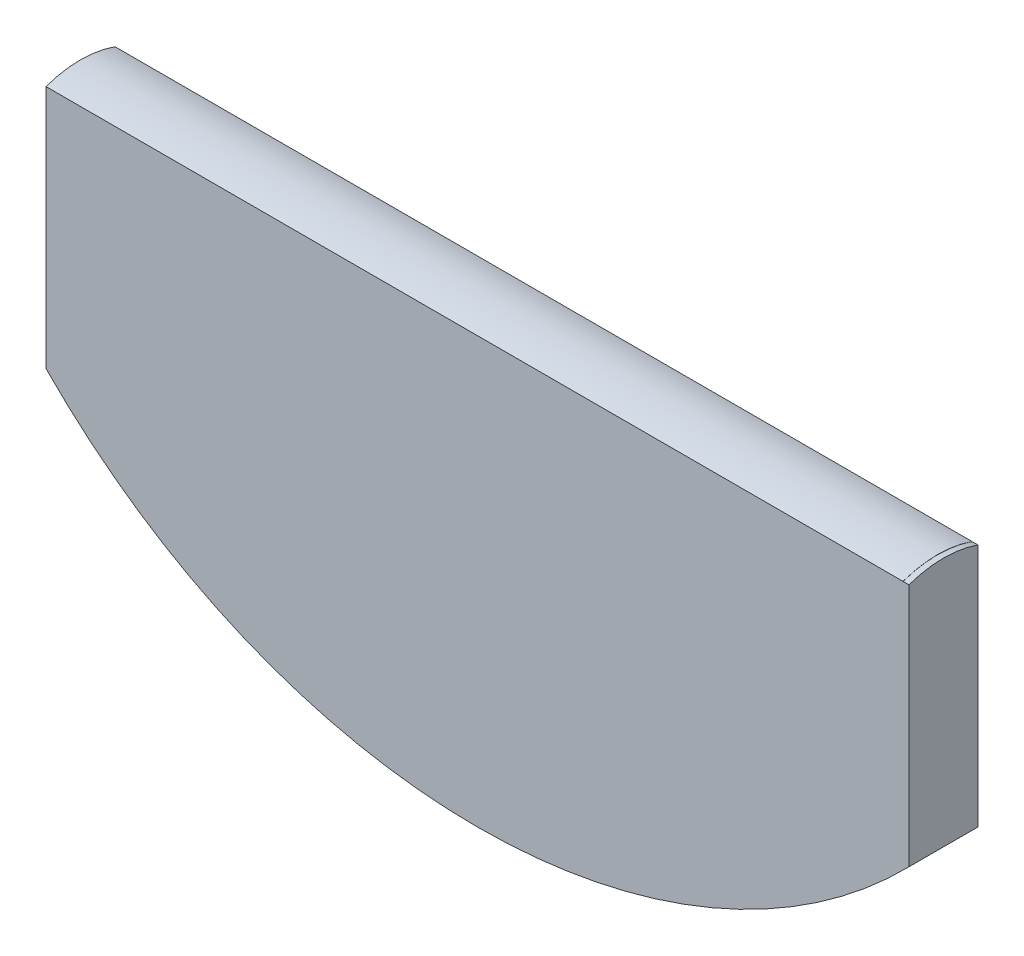
ISO-10303-21;
HEADER;
FILE_DESCRIPTION(('STEP AP214'),'2;1');
FILE_NAME('part.step','',(''),(''),'','','');
FILE_SCHEMA(('AUTOMOTIVE_DESIGN { 1 0 10303 214 1 1 1 1 }'));
ENDSEC;
DATA;
#1=APPLICATION_CONTEXT('core data for automotive mechanical design processes');
#2=APPLICATION_PROTOCOL_DEFINITION('international standard','automotive_design',2000,#1);
#3=PRODUCT_CONTEXT('',#1,'mechanical');
#4=PRODUCT('Part','Part','',(#3));
#5=PRODUCT_RELATED_PRODUCT_CATEGORY('part','',(#4));
#6=PRODUCT_DEFINITION_FORMATION('','',#4);
#7=PRODUCT_DEFINITION_CONTEXT('part definition',#1,'design');
#8=PRODUCT_DEFINITION('design','',#6,#7);
#9=PRODUCT_DEFINITION_SHAPE('','',#8);
#10=(LENGTH_UNIT() NAMED_UNIT(*) SI_UNIT(.MILLI.,.METRE.));
#11=(NAMED_UNIT(*) PLANE_ANGLE_UNIT() SI_UNIT($,.RADIAN.));
#12=(NAMED_UNIT(*) SI_UNIT($,.STERADIAN.) SOLID_ANGLE_UNIT());
#13=UNCERTAINTY_MEASURE_WITH_UNIT(LENGTH_MEASURE(1.E-05),#10,'distance_accuracy_value','');
#14=(GEOMETRIC_REPRESENTATION_CONTEXT(3) GLOBAL_UNCERTAINTY_ASSIGNED_CONTEXT((#13)) GLOBAL_UNIT_ASSIGNED_CONTEXT((#10,
#11,#12)) REPRESENTATION_CONTEXT('',''));
#15=CARTESIAN_POINT('',(0.,0.,0.));
#16=DIRECTION('',(0.,0.,1.));
#17=DIRECTION('',(1.,0.,0.));
#18=AXIS2_PLACEMENT_3D('',#15,#16,#17);
#19=CARTESIAN_POINT('',(0.,0.,2.));
#20=DIRECTION('',(0.,0.,-1.));
#21=DIRECTION('',(-1.,0.,0.));
#22=AXIS2_PLACEMENT_3D('',#19,#20,#21);
#23=CYLINDRICAL_SURFACE('',#22,35.);
#24=CARTESIAN_POINT('',(0.,0.,-2.));
#25=DIRECTION('',(0.,0.,1.));
#26=DIRECTION('',(1.,0.,0.));
#27=AXIS2_PLACEMENT_3D('',#24,#25,#26);
#28=CIRCLE('',#27,35.);
#29=CARTESIAN_POINT('',(-25.,-24.4948974278318,-2.));
#30=VERTEX_POINT('',#29);
#31=CARTESIAN_POINT('',(25.,-24.4948974278318,-2.));
#32=VERTEX_POINT('',#31);
#33=EDGE_CURVE('E420',#30,#32,#28,.T.);
#34=ORIENTED_EDGE('',*,*,#33,.T.);
#35=DIRECTION('',(0.,0.,-1.));
#36=VECTOR('',#35,1.);
#37=CARTESIAN_POINT('',(25.,-24.4948974278318,2.));
#38=LINE('',#37,#36);
#39=CARTESIAN_POINT('',(25.,-24.4948974278318,2.));
#40=VERTEX_POINT('',#39);
#41=EDGE_CURVE('E441',#40,#32,#38,.T.);
#42=ORIENTED_EDGE('',*,*,#41,.F.);
#43=CARTESIAN_POINT('',(0.,0.,2.));
#44=DIRECTION('',(0.,0.,1.));
#45=DIRECTION('',(1.,0.,0.));
#46=AXIS2_PLACEMENT_3D('',#43,#44,#45);
#47=CIRCLE('',#46,35.);
#48=CARTESIAN_POINT('',(-25.,-24.4948974278318,2.));
#49=VERTEX_POINT('',#48);
#50=EDGE_CURVE('E433',#49,#40,#47,.T.);
#51=ORIENTED_EDGE('',*,*,#50,.F.);
#52=DIRECTION('',(0.,0.,-1.));
#53=VECTOR('',#52,1.);
#54=CARTESIAN_POINT('',(-25.,-24.4948974278318,2.));
#55=LINE('',#54,#53);
#56=EDGE_CURVE('E438',#49,#30,#55,.T.);
#57=ORIENTED_EDGE('',*,*,#56,.T.);
#58=EDGE_LOOP('',(#34,#42,#51,#57));
#59=FACE_BOUND('',#58,.T.);
#60=ADVANCED_FACE('F349',(#59),#23,.T.);
#61=CARTESIAN_POINT('',(25.,-10.,2.));
#62=DIRECTION('',(-1.,0.,0.));
#63=DIRECTION('',(0.,-1.,0.));
#64=AXIS2_PLACEMENT_3D('',#61,#62,#63);
#65=PLANE('',#64);
#66=DIRECTION('',(0.,1.,0.));
#67=VECTOR('',#66,1.);
#68=CARTESIAN_POINT('',(25.,-10.,-2.));
#69=LINE('',#68,#67);
#70=CARTESIAN_POINT('',(25.,-10.3431457505076,-2.));
#71=VERTEX_POINT('',#70);
#72=EDGE_CURVE('E423',#32,#71,#69,.T.);
#73=ORIENTED_EDGE('',*,*,#72,.T.);
#74=CARTESIAN_POINT('',(25.,-16.,0.));
#75=DIRECTION('',(-1.,0.,0.));
#76=DIRECTION('',(0.,-1.,0.));
#77=AXIS2_PLACEMENT_3D('',#74,#75,#76);
#78=CIRCLE('',#77,6.);
#79=CARTESIAN_POINT('',(25.,-10.3431457505076,2.));
#80=VERTEX_POINT('',#79);
#81=EDGE_CURVE('E425',#71,#80,#78,.F.);
#82=ORIENTED_EDGE('',*,*,#81,.T.);
#83=DIRECTION('',(0.,1.,0.));
#84=VECTOR('',#83,1.);
#85=CARTESIAN_POINT('',(25.,-10.,2.));
#86=LINE('',#85,#84);
#87=EDGE_CURVE('E435',#40,#80,#86,.T.);
#88=ORIENTED_EDGE('',*,*,#87,.F.);
#89=ORIENTED_EDGE('',*,*,#41,.T.);
#90=EDGE_LOOP('',(#73,#82,#88,#89));
#91=FACE_BOUND('',#90,.T.);
#92=ADVANCED_FACE('F455',(#91),#65,.F.);
#93=CARTESIAN_POINT('',(-25.,-10.,2.));
#94=DIRECTION('',(1.,0.,0.));
#95=DIRECTION('',(0.,1.,0.));
#96=AXIS2_PLACEMENT_3D('',#93,#94,#95);
#97=PLANE('',#96);
#98=CARTESIAN_POINT('',(-25.,-16.,0.));
#99=DIRECTION('',(1.,0.,0.));
#100=DIRECTION('',(0.,1.,0.));
#101=AXIS2_PLACEMENT_3D('',#98,#99,#100);
#102=CIRCLE('',#101,6.);
#103=CARTESIAN_POINT('',(-25.,-10.3431457505076,2.));
#104=VERTEX_POINT('',#103);
#105=CARTESIAN_POINT('',(-25.,-10.3431457505076,-2.));
#106=VERTEX_POINT('',#105);
#107=EDGE_CURVE('E403',#104,#106,#102,.F.);
#108=ORIENTED_EDGE('',*,*,#107,.T.);
#109=DIRECTION('',(0.,-1.,0.));
#110=VECTOR('',#109,1.);
#111=CARTESIAN_POINT('',(-25.,-10.,-2.));
#112=LINE('',#111,#110);
#113=EDGE_CURVE('E431',#106,#30,#112,.T.);
#114=ORIENTED_EDGE('',*,*,#113,.T.);
#115=ORIENTED_EDGE('',*,*,#56,.F.);
#116=DIRECTION('',(0.,-1.,0.));
#117=VECTOR('',#116,1.);
#118=CARTESIAN_POINT('',(-25.,-10.,2.));
#119=LINE('',#118,#117);
#120=EDGE_CURVE('E371',#104,#49,#119,.T.);
#121=ORIENTED_EDGE('',*,*,#120,.F.);
#122=EDGE_LOOP('',(#108,#114,#115,#121));
#123=FACE_BOUND('',#122,.T.);
#124=ADVANCED_FACE('F450',(#123),#97,.F.);
#125=CARTESIAN_POINT('',(0.,0.,2.));
#126=DIRECTION('',(0.,0.,1.));
#127=DIRECTION('',(1.,0.,0.));
#128=AXIS2_PLACEMENT_3D('',#125,#126,#127);
#129=PLANE('',#128);
#130=CARTESIAN_POINT('',(25.,-16.,2.));
#131=DIRECTION('',(0.,0.,1.));
#132=DIRECTION('',(1.,0.,0.));
#133=AXIS2_PLACEMENT_3D('',#130,#131,#132);
#134=CIRCLE('',#133,5.65685424949238);
#135=CARTESIAN_POINT('',(24.6537342061364,-10.3537534591554,2.));
#136=VERTEX_POINT('',#135);
#137=EDGE_CURVE('E419',#136,#80,#134,.F.);
#138=ORIENTED_EDGE('',*,*,#137,.F.);
#139=DIRECTION('',(0.,-1.,0.));
#140=VECTOR('',#139,1.);
#141=CARTESIAN_POINT('',(24.6537342061364,0.,2.));
#142=LINE('',#141,#140);
#143=CARTESIAN_POINT('',(24.6537342061364,-10.3431457505076,2.));
#144=VERTEX_POINT('',#143);
#145=EDGE_CURVE('E410',#144,#136,#142,.T.);
#146=ORIENTED_EDGE('',*,*,#145,.F.);
#147=DIRECTION('',(1.,0.,0.));
#148=VECTOR('',#147,1.);
#149=CARTESIAN_POINT('',(32.8285734661625,-10.3431457505076,2.));
#150=LINE('',#149,#148);
#151=EDGE_CURVE('E401',#104,#144,#150,.T.);
#152=ORIENTED_EDGE('',*,*,#151,.F.);
#153=ORIENTED_EDGE('',*,*,#120,.T.);
#154=ORIENTED_EDGE('',*,*,#50,.T.);
#155=ORIENTED_EDGE('',*,*,#87,.T.);
#156=EDGE_LOOP('',(#138,#146,#152,#153,#154,#155));
#157=FACE_BOUND('',#156,.T.);
#158=ADVANCED_FACE('F416',(#157),#129,.T.);
#159=CARTESIAN_POINT('',(0.,0.,-2.));
#160=DIRECTION('',(0.,0.,1.));
#161=DIRECTION('',(1.,0.,0.));
#162=AXIS2_PLACEMENT_3D('',#159,#160,#161);
#163=PLANE('',#162);
#164=DIRECTION('',(0.,-1.,0.));
#165=VECTOR('',#164,1.);
#166=CARTESIAN_POINT('',(24.6537342061364,0.,-2.));
#167=LINE('',#166,#165);
#168=CARTESIAN_POINT('',(24.6537342061364,-10.3431457505076,-2.));
#169=VERTEX_POINT('',#168);
#170=CARTESIAN_POINT('',(24.6537342061364,-10.3537534591554,-2.));
#171=VERTEX_POINT('',#170);
#172=EDGE_CURVE('E356',#169,#171,#167,.T.);
#173=ORIENTED_EDGE('',*,*,#172,.T.);
#174=CARTESIAN_POINT('',(25.,-16.,-2.));
#175=DIRECTION('',(0.,0.,1.));
#176=DIRECTION('',(1.,0.,0.));
#177=AXIS2_PLACEMENT_3D('',#174,#175,#176);
#178=CIRCLE('',#177,5.65685424949238);
#179=EDGE_CURVE('E11',#171,#71,#178,.F.);
#180=ORIENTED_EDGE('',*,*,#179,.T.);
#181=ORIENTED_EDGE('',*,*,#72,.F.);
#182=ORIENTED_EDGE('',*,*,#33,.F.);
#183=ORIENTED_EDGE('',*,*,#113,.F.);
#184=DIRECTION('',(1.,0.,0.));
#185=VECTOR('',#184,1.);
#186=CARTESIAN_POINT('',(32.8285734661625,-10.3431457505076,-2.));
#187=LINE('',#186,#185);
#188=EDGE_CURVE('E444',#106,#169,#187,.T.);
#189=ORIENTED_EDGE('',*,*,#188,.T.);
#190=EDGE_LOOP('',(#173,#180,#181,#182,#183,#189));
#191=FACE_BOUND('',#190,.T.);
#192=ADVANCED_FACE('F446',(#191),#163,.F.);
#193=CARTESIAN_POINT('',(24.6537342061364,-11.7573593128807,-4.24264068711929));
#194=DIRECTION('',(-1.,0.,0.));
#195=DIRECTION('',(0.,-1.,0.));
#196=AXIS2_PLACEMENT_3D('',#193,#194,#195);
#197=PLANE('',#196);
#198=ORIENTED_EDGE('',*,*,#145,.T.);
#199=CARTESIAN_POINT('',(24.6537342061364,-16.,0.));
#200=DIRECTION('',(1.,0.,0.));
#201=DIRECTION('',(0.,1.,0.));
#202=AXIS2_PLACEMENT_3D('',#199,#200,#201);
#203=CIRCLE('',#202,5.99);
#204=EDGE_CURVE('E405',#171,#136,#203,.T.);
#205=ORIENTED_EDGE('',*,*,#204,.F.);
#206=ORIENTED_EDGE('',*,*,#172,.F.);
#207=CARTESIAN_POINT('',(24.6537342061364,-16.,0.));
#208=DIRECTION('',(1.,0.,0.));
#209=DIRECTION('',(0.,1.,0.));
#210=AXIS2_PLACEMENT_3D('',#207,#208,#209);
#211=CIRCLE('',#210,6.);
#212=EDGE_CURVE('E363',#169,#144,#211,.T.);
#213=ORIENTED_EDGE('',*,*,#212,.T.);
#214=EDGE_LOOP('',(#198,#205,#206,#213));
#215=FACE_BOUND('',#214,.T.);
#216=ADVANCED_FACE('F408',(#215),#197,.F.);
#217=CARTESIAN_POINT('',(32.8285734661625,-16.,0.));
#218=DIRECTION('',(1.,0.,0.));
#219=DIRECTION('',(0.,1.,0.));
#220=AXIS2_PLACEMENT_3D('',#217,#218,#219);
#221=CYLINDRICAL_SURFACE('',#220,6.);
#222=ORIENTED_EDGE('',*,*,#151,.T.);
#223=ORIENTED_EDGE('',*,*,#212,.F.);
#224=ORIENTED_EDGE('',*,*,#188,.F.);
#225=ORIENTED_EDGE('',*,*,#107,.F.);
#226=EDGE_LOOP('',(#222,#223,#224,#225));
#227=FACE_BOUND('',#226,.T.);
#228=ADVANCED_FACE('F402',(#227),#221,.T.);
#229=CARTESIAN_POINT('',(25.,-16.,0.));
#230=DIRECTION('',(1.,0.,0.));
#231=DIRECTION('',(0.,0.707106781186546,-0.707106781186549));
#232=AXIS2_PLACEMENT_3D('',#229,#230,#231);
#233=SPHERICAL_SURFACE('',#232,6.);
#234=ORIENTED_EDGE('',*,*,#137,.T.);
#235=ORIENTED_EDGE('',*,*,#81,.F.);
#236=ORIENTED_EDGE('',*,*,#179,.F.);
#237=ORIENTED_EDGE('',*,*,#204,.T.);
#238=EDGE_LOOP('',(#234,#235,#236,#237));
#239=FACE_BOUND('',#238,.T.);
#240=ADVANCED_FACE('F457',(#239),#233,.T.);
#241=CLOSED_SHELL('',(#60,#92,#124,#158,#192,#216,#228,#240));
#242=MANIFOLD_SOLID_BREP('B2',#241);
#243=ADVANCED_BREP_SHAPE_REPRESENTATION('',(#18,#242),#14);
#244=SHAPE_DEFINITION_REPRESENTATION(#9,#243);
ENDSEC;
END-ISO-10303-21;
